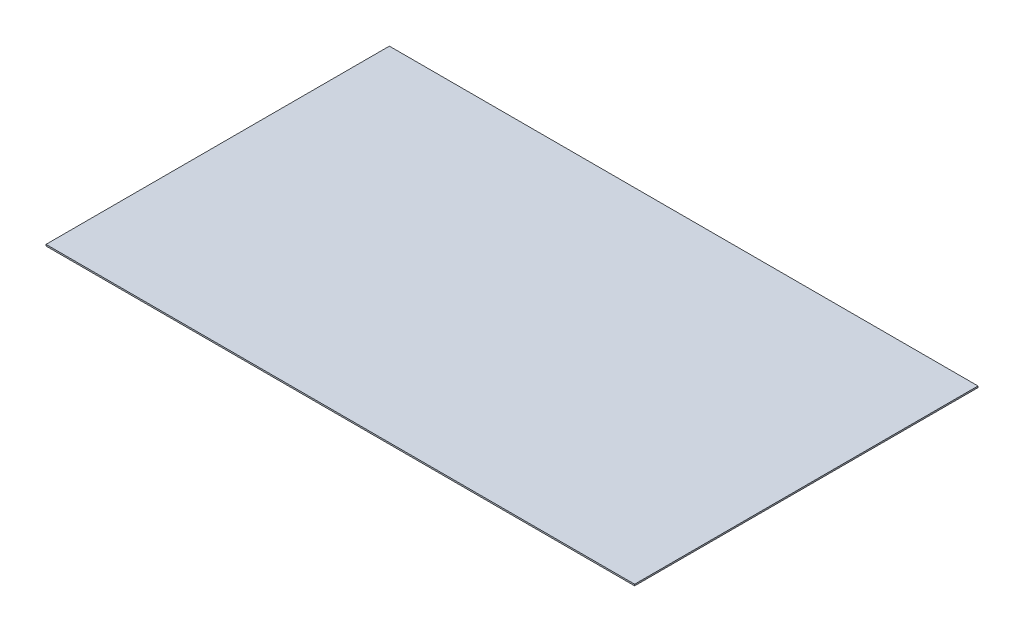
ISO-10303-21;
HEADER;
FILE_DESCRIPTION(('STEP AP214'),'2;1');
FILE_NAME('part.step','',(''),(''),'','','');
FILE_SCHEMA(('AUTOMOTIVE_DESIGN { 1 0 10303 214 1 1 1 1 }'));
ENDSEC;
DATA;
#1=APPLICATION_CONTEXT('core data for automotive mechanical design processes');
#2=APPLICATION_PROTOCOL_DEFINITION('international standard','automotive_design',2000,#1);
#3=PRODUCT_CONTEXT('',#1,'mechanical');
#4=PRODUCT('Part','Part','',(#3));
#5=PRODUCT_RELATED_PRODUCT_CATEGORY('part','',(#4));
#6=PRODUCT_DEFINITION_FORMATION('','',#4);
#7=PRODUCT_DEFINITION_CONTEXT('part definition',#1,'design');
#8=PRODUCT_DEFINITION('design','',#6,#7);
#9=PRODUCT_DEFINITION_SHAPE('','',#8);
#10=(LENGTH_UNIT() NAMED_UNIT(*) SI_UNIT(.MILLI.,.METRE.));
#11=(NAMED_UNIT(*) PLANE_ANGLE_UNIT() SI_UNIT($,.RADIAN.));
#12=(NAMED_UNIT(*) SI_UNIT($,.STERADIAN.) SOLID_ANGLE_UNIT());
#13=UNCERTAINTY_MEASURE_WITH_UNIT(LENGTH_MEASURE(1.E-05),#10,'distance_accuracy_value','');
#14=(GEOMETRIC_REPRESENTATION_CONTEXT(3) GLOBAL_UNCERTAINTY_ASSIGNED_CONTEXT((#13)) GLOBAL_UNIT_ASSIGNED_CONTEXT((#10,
#11,#12)) REPRESENTATION_CONTEXT('',''));
#15=CARTESIAN_POINT('',(0.,0.,0.));
#16=DIRECTION('',(0.,0.,1.));
#17=DIRECTION('',(1.,0.,0.));
#18=AXIS2_PLACEMENT_3D('',#15,#16,#17);
#19=CARTESIAN_POINT('',(-600.,3.,350.));
#20=DIRECTION('',(1.,0.,0.));
#21=DIRECTION('',(0.,0.,-1.));
#22=AXIS2_PLACEMENT_3D('',#19,#20,#21);
#23=PLANE('',#22);
#24=DIRECTION('',(0.,0.,1.));
#25=VECTOR('',#24,1.);
#26=CARTESIAN_POINT('',(-600.,0.,350.));
#27=LINE('',#26,#25);
#28=CARTESIAN_POINT('',(-600.,0.,-350.));
#29=VERTEX_POINT('',#28);
#30=CARTESIAN_POINT('',(-600.,0.,350.));
#31=VERTEX_POINT('',#30);
#32=EDGE_CURVE('E95',#29,#31,#27,.T.);
#33=ORIENTED_EDGE('',*,*,#32,.T.);
#34=DIRECTION('',(0.,-1.,0.));
#35=VECTOR('',#34,1.);
#36=CARTESIAN_POINT('',(-600.,3.,350.));
#37=LINE('',#36,#35);
#38=CARTESIAN_POINT('',(-600.,3.,350.));
#39=VERTEX_POINT('',#38);
#40=EDGE_CURVE('E11',#39,#31,#37,.T.);
#41=ORIENTED_EDGE('',*,*,#40,.F.);
#42=DIRECTION('',(0.,0.,1.));
#43=VECTOR('',#42,1.);
#44=CARTESIAN_POINT('',(-600.,3.,350.));
#45=LINE('',#44,#43);
#46=CARTESIAN_POINT('',(-600.,3.,-350.));
#47=VERTEX_POINT('',#46);
#48=EDGE_CURVE('E83',#47,#39,#45,.T.);
#49=ORIENTED_EDGE('',*,*,#48,.F.);
#50=DIRECTION('',(0.,-1.,0.));
#51=VECTOR('',#50,1.);
#52=CARTESIAN_POINT('',(-600.,3.,-350.));
#53=LINE('',#52,#51);
#54=EDGE_CURVE('E91',#47,#29,#53,.T.);
#55=ORIENTED_EDGE('',*,*,#54,.T.);
#56=EDGE_LOOP('',(#33,#41,#49,#55));
#57=FACE_BOUND('',#56,.T.);
#58=ADVANCED_FACE('F32',(#57),#23,.F.);
#59=CARTESIAN_POINT('',(600.,3.,350.));
#60=DIRECTION('',(0.,0.,-1.));
#61=DIRECTION('',(-1.,0.,0.));
#62=AXIS2_PLACEMENT_3D('',#59,#60,#61);
#63=PLANE('',#62);
#64=DIRECTION('',(1.,0.,0.));
#65=VECTOR('',#64,1.);
#66=CARTESIAN_POINT('',(600.,0.,350.));
#67=LINE('',#66,#65);
#68=CARTESIAN_POINT('',(600.,0.,350.));
#69=VERTEX_POINT('',#68);
#70=EDGE_CURVE('E87',#31,#69,#67,.T.);
#71=ORIENTED_EDGE('',*,*,#70,.T.);
#72=DIRECTION('',(0.,-1.,0.));
#73=VECTOR('',#72,1.);
#74=CARTESIAN_POINT('',(600.,3.,350.));
#75=LINE('',#74,#73);
#76=CARTESIAN_POINT('',(600.,3.,350.));
#77=VERTEX_POINT('',#76);
#78=EDGE_CURVE('E40',#77,#69,#75,.T.);
#79=ORIENTED_EDGE('',*,*,#78,.F.);
#80=DIRECTION('',(1.,0.,0.));
#81=VECTOR('',#80,1.);
#82=CARTESIAN_POINT('',(600.,3.,350.));
#83=LINE('',#82,#81);
#84=EDGE_CURVE('E78',#39,#77,#83,.T.);
#85=ORIENTED_EDGE('',*,*,#84,.F.);
#86=ORIENTED_EDGE('',*,*,#40,.T.);
#87=EDGE_LOOP('',(#71,#79,#85,#86));
#88=FACE_BOUND('',#87,.T.);
#89=ADVANCED_FACE('F86',(#88),#63,.F.);
#90=CARTESIAN_POINT('',(600.,3.,350.));
#91=DIRECTION('',(-1.,0.,0.));
#92=DIRECTION('',(0.,0.,1.));
#93=AXIS2_PLACEMENT_3D('',#90,#91,#92);
#94=PLANE('',#93);
#95=DIRECTION('',(0.,0.,-1.));
#96=VECTOR('',#95,1.);
#97=CARTESIAN_POINT('',(600.,0.,350.));
#98=LINE('',#97,#96);
#99=CARTESIAN_POINT('',(600.,0.,-350.));
#100=VERTEX_POINT('',#99);
#101=EDGE_CURVE('E65',#69,#100,#98,.T.);
#102=ORIENTED_EDGE('',*,*,#101,.T.);
#103=DIRECTION('',(0.,-1.,0.));
#104=VECTOR('',#103,1.);
#105=CARTESIAN_POINT('',(600.,3.,-350.));
#106=LINE('',#105,#104);
#107=CARTESIAN_POINT('',(600.,3.,-350.));
#108=VERTEX_POINT('',#107);
#109=EDGE_CURVE('E88',#108,#100,#106,.T.);
#110=ORIENTED_EDGE('',*,*,#109,.F.);
#111=DIRECTION('',(0.,0.,-1.));
#112=VECTOR('',#111,1.);
#113=CARTESIAN_POINT('',(600.,3.,350.));
#114=LINE('',#113,#112);
#115=EDGE_CURVE('E81',#77,#108,#114,.T.);
#116=ORIENTED_EDGE('',*,*,#115,.F.);
#117=ORIENTED_EDGE('',*,*,#78,.T.);
#118=EDGE_LOOP('',(#102,#110,#116,#117));
#119=FACE_BOUND('',#118,.T.);
#120=ADVANCED_FACE('F89',(#119),#94,.F.);
#121=CARTESIAN_POINT('',(600.,3.,-350.));
#122=DIRECTION('',(0.,0.,1.));
#123=DIRECTION('',(1.,0.,0.));
#124=AXIS2_PLACEMENT_3D('',#121,#122,#123);
#125=PLANE('',#124);
#126=DIRECTION('',(-1.,0.,0.));
#127=VECTOR('',#126,1.);
#128=CARTESIAN_POINT('',(600.,0.,-350.));
#129=LINE('',#128,#127);
#130=EDGE_CURVE('E71',#100,#29,#129,.T.);
#131=ORIENTED_EDGE('',*,*,#130,.T.);
#132=ORIENTED_EDGE('',*,*,#54,.F.);
#133=DIRECTION('',(-1.,0.,0.));
#134=VECTOR('',#133,1.);
#135=CARTESIAN_POINT('',(600.,3.,-350.));
#136=LINE('',#135,#134);
#137=EDGE_CURVE('E48',#108,#47,#136,.T.);
#138=ORIENTED_EDGE('',*,*,#137,.F.);
#139=ORIENTED_EDGE('',*,*,#109,.T.);
#140=EDGE_LOOP('',(#131,#132,#138,#139));
#141=FACE_BOUND('',#140,.T.);
#142=ADVANCED_FACE('F102',(#141),#125,.F.);
#143=CARTESIAN_POINT('',(0.,3.,0.));
#144=DIRECTION('',(0.,1.,0.));
#145=DIRECTION('',(0.,0.,1.));
#146=AXIS2_PLACEMENT_3D('',#143,#144,#145);
#147=PLANE('',#146);
#148=ORIENTED_EDGE('',*,*,#48,.T.);
#149=ORIENTED_EDGE('',*,*,#84,.T.);
#150=ORIENTED_EDGE('',*,*,#115,.T.);
#151=ORIENTED_EDGE('',*,*,#137,.T.);
#152=EDGE_LOOP('',(#148,#149,#150,#151));
#153=FACE_BOUND('',#152,.T.);
#154=ADVANCED_FACE('F79',(#153),#147,.T.);
#155=CARTESIAN_POINT('',(0.,0.,0.));
#156=DIRECTION('',(0.,1.,0.));
#157=DIRECTION('',(0.,0.,1.));
#158=AXIS2_PLACEMENT_3D('',#155,#156,#157);
#159=PLANE('',#158);
#160=ORIENTED_EDGE('',*,*,#32,.F.);
#161=ORIENTED_EDGE('',*,*,#130,.F.);
#162=ORIENTED_EDGE('',*,*,#101,.F.);
#163=ORIENTED_EDGE('',*,*,#70,.F.);
#164=EDGE_LOOP('',(#160,#161,#162,#163));
#165=FACE_BOUND('',#164,.T.);
#166=ADVANCED_FACE('F105',(#165),#159,.F.);
#167=CLOSED_SHELL('',(#58,#89,#120,#142,#154,#166));
#168=MANIFOLD_SOLID_BREP('B2',#167);
#169=ADVANCED_BREP_SHAPE_REPRESENTATION('',(#18,#168),#14);
#170=SHAPE_DEFINITION_REPRESENTATION(#9,#169);
ENDSEC;
END-ISO-10303-21;
